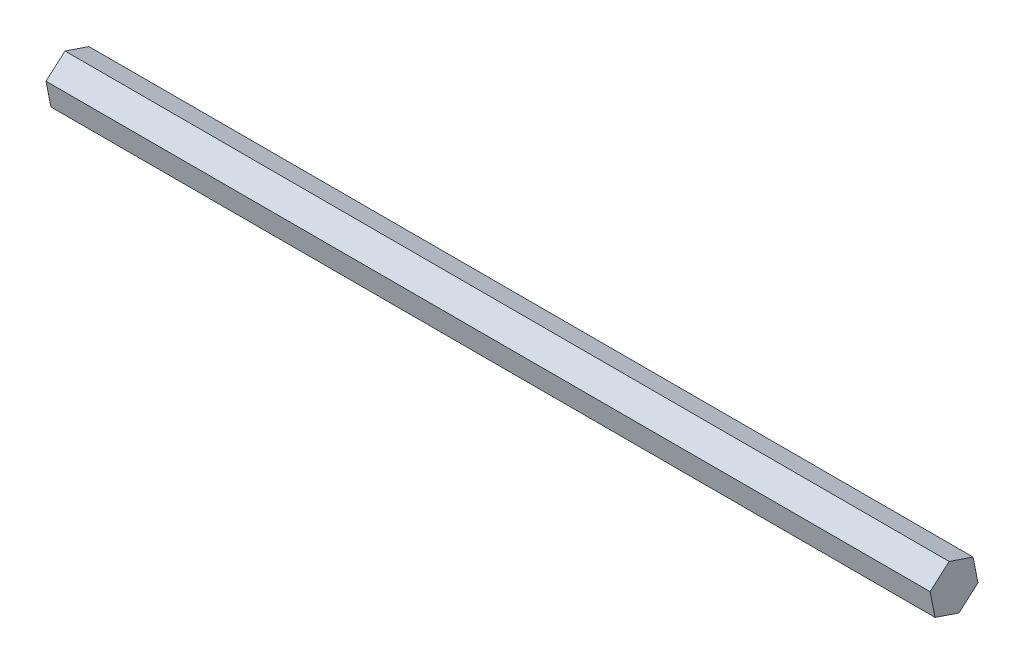
ISO-10303-21;
HEADER;
FILE_DESCRIPTION(('STEP AP214'),'2;1');
FILE_NAME('part.step','',(''),(''),'','','');
FILE_SCHEMA(('AUTOMOTIVE_DESIGN { 1 0 10303 214 1 1 1 1 }'));
ENDSEC;
DATA;
#1=APPLICATION_CONTEXT('core data for automotive mechanical design processes');
#2=APPLICATION_PROTOCOL_DEFINITION('international standard','automotive_design',2000,#1);
#3=PRODUCT_CONTEXT('',#1,'mechanical');
#4=PRODUCT('Part','Part','',(#3));
#5=PRODUCT_RELATED_PRODUCT_CATEGORY('part','',(#4));
#6=PRODUCT_DEFINITION_FORMATION('','',#4);
#7=PRODUCT_DEFINITION_CONTEXT('part definition',#1,'design');
#8=PRODUCT_DEFINITION('design','',#6,#7);
#9=PRODUCT_DEFINITION_SHAPE('','',#8);
#10=(LENGTH_UNIT() NAMED_UNIT(*) SI_UNIT(.MILLI.,.METRE.));
#11=(NAMED_UNIT(*) PLANE_ANGLE_UNIT() SI_UNIT($,.RADIAN.));
#12=(NAMED_UNIT(*) SI_UNIT($,.STERADIAN.) SOLID_ANGLE_UNIT());
#13=UNCERTAINTY_MEASURE_WITH_UNIT(LENGTH_MEASURE(1.E-05),#10,'distance_accuracy_value','');
#14=(GEOMETRIC_REPRESENTATION_CONTEXT(3) GLOBAL_UNCERTAINTY_ASSIGNED_CONTEXT((#13)) GLOBAL_UNIT_ASSIGNED_CONTEXT((#10,
#11,#12)) REPRESENTATION_CONTEXT('',''));
#15=CARTESIAN_POINT('',(0.,0.,0.));
#16=DIRECTION('',(0.,0.,1.));
#17=DIRECTION('',(1.,0.,0.));
#18=AXIS2_PLACEMENT_3D('',#15,#16,#17);
#19=CARTESIAN_POINT('',(256.54,-2.35794292459165,-6.94286961549052));
#20=DIRECTION('',(0.,-0.194943864196095,0.980814401307553));
#21=DIRECTION('',(0.,-0.980814401307553,-0.194943864196095));
#22=AXIS2_PLACEMENT_3D('',#19,#20,#21);
#23=PLANE('',#22);
#24=DIRECTION('',(0.,0.980814401307553,0.194943864196095));
#25=VECTOR('',#24,1.);
#26=CARTESIAN_POINT('',(0.,-2.35794292459165,-6.94286961549052));
#27=LINE('',#26,#25);
#28=CARTESIAN_POINT('',(0.,-2.35794292459165,-6.94286961549052));
#29=VERTEX_POINT('',#28);
#30=CARTESIAN_POINT('',(0.,4.83372999988206,-5.5134732811154));
#31=VERTEX_POINT('',#30);
#32=EDGE_CURVE('E117',#29,#31,#27,.T.);
#33=ORIENTED_EDGE('',*,*,#32,.T.);
#34=DIRECTION('',(-1.,0.,0.));
#35=VECTOR('',#34,1.);
#36=CARTESIAN_POINT('',(256.54,4.83372999988206,-5.5134732811154));
#37=LINE('',#36,#35);
#38=CARTESIAN_POINT('',(256.54,4.83372999988206,-5.5134732811154));
#39=VERTEX_POINT('',#38);
#40=EDGE_CURVE('E11',#39,#31,#37,.T.);
#41=ORIENTED_EDGE('',*,*,#40,.F.);
#42=DIRECTION('',(0.,0.980814401307553,0.194943864196095));
#43=VECTOR('',#42,1.);
#44=CARTESIAN_POINT('',(256.54,-2.35794292459165,-6.94286961549052));
#45=LINE('',#44,#43);
#46=CARTESIAN_POINT('',(256.54,-2.35794292459165,-6.94286961549052));
#47=VERTEX_POINT('',#46);
#48=EDGE_CURVE('E127',#47,#39,#45,.T.);
#49=ORIENTED_EDGE('',*,*,#48,.F.);
#50=DIRECTION('',(-1.,0.,0.));
#51=VECTOR('',#50,1.);
#52=CARTESIAN_POINT('',(256.54,-2.35794292459165,-6.94286961549052));
#53=LINE('',#52,#51);
#54=EDGE_CURVE('E113',#47,#29,#53,.T.);
#55=ORIENTED_EDGE('',*,*,#54,.T.);
#56=EDGE_LOOP('',(#33,#41,#49,#55));
#57=FACE_BOUND('',#56,.T.);
#58=ADVANCED_FACE('F33',(#57),#23,.F.);
#59=CARTESIAN_POINT('',(256.54,4.83372999988206,-5.5134732811154));
#60=DIRECTION('',(0.,-0.946882120028014,0.321580861948055));
#61=DIRECTION('',(0.,-0.321580861948055,-0.946882120028014));
#62=AXIS2_PLACEMENT_3D('',#59,#60,#61);
#63=PLANE('',#62);
#64=DIRECTION('',(0.,0.321580861948054,0.946882120028014));
#65=VECTOR('',#64,1.);
#66=CARTESIAN_POINT('',(0.,4.83372999988206,-5.5134732811154));
#67=LINE('',#66,#65);
#68=CARTESIAN_POINT('',(0.,7.19167292447371,1.42939633437511));
#69=VERTEX_POINT('',#68);
#70=EDGE_CURVE('E120',#31,#69,#67,.T.);
#71=ORIENTED_EDGE('',*,*,#70,.T.);
#72=DIRECTION('',(-1.,0.,0.));
#73=VECTOR('',#72,1.);
#74=CARTESIAN_POINT('',(256.54,7.19167292447371,1.42939633437511));
#75=LINE('',#74,#73);
#76=CARTESIAN_POINT('',(256.54,7.19167292447371,1.42939633437511));
#77=VERTEX_POINT('',#76);
#78=EDGE_CURVE('E41',#77,#69,#75,.T.);
#79=ORIENTED_EDGE('',*,*,#78,.F.);
#80=DIRECTION('',(0.,0.321580861948054,0.946882120028014));
#81=VECTOR('',#80,1.);
#82=CARTESIAN_POINT('',(256.54,4.83372999988206,-5.5134732811154));
#83=LINE('',#82,#81);
#84=EDGE_CURVE('E86',#39,#77,#83,.T.);
#85=ORIENTED_EDGE('',*,*,#84,.F.);
#86=ORIENTED_EDGE('',*,*,#40,.T.);
#87=EDGE_LOOP('',(#71,#79,#85,#86));
#88=FACE_BOUND('',#87,.T.);
#89=ADVANCED_FACE('F151',(#88),#63,.F.);
#90=CARTESIAN_POINT('',(256.54,7.19167292447371,1.42939633437511));
#91=DIRECTION('',(0.,-0.751938255831918,-0.659233539359499));
#92=DIRECTION('',(0.,0.659233539359499,-0.751938255831919));
#93=AXIS2_PLACEMENT_3D('',#90,#91,#92);
#94=PLANE('',#93);
#95=DIRECTION('',(0.,-0.659233539359499,0.751938255831918));
#96=VECTOR('',#95,1.);
#97=CARTESIAN_POINT('',(0.,7.19167292447371,1.42939633437511));
#98=LINE('',#97,#96);
#99=CARTESIAN_POINT('',(0.,2.35794292459165,6.94286961549052));
#100=VERTEX_POINT('',#99);
#101=EDGE_CURVE('E122',#69,#100,#98,.T.);
#102=ORIENTED_EDGE('',*,*,#101,.T.);
#103=DIRECTION('',(-1.,0.,0.));
#104=VECTOR('',#103,1.);
#105=CARTESIAN_POINT('',(256.54,2.35794292459165,6.94286961549052));
#106=LINE('',#105,#104);
#107=CARTESIAN_POINT('',(256.54,2.35794292459165,6.94286961549052));
#108=VERTEX_POINT('',#107);
#109=EDGE_CURVE('E108',#108,#100,#106,.T.);
#110=ORIENTED_EDGE('',*,*,#109,.F.);
#111=DIRECTION('',(0.,-0.659233539359499,0.751938255831918));
#112=VECTOR('',#111,1.);
#113=CARTESIAN_POINT('',(256.54,7.19167292447371,1.42939633437511));
#114=LINE('',#113,#112);
#115=EDGE_CURVE('E99',#77,#108,#114,.T.);
#116=ORIENTED_EDGE('',*,*,#115,.F.);
#117=ORIENTED_EDGE('',*,*,#78,.T.);
#118=EDGE_LOOP('',(#102,#110,#116,#117));
#119=FACE_BOUND('',#118,.T.);
#120=ADVANCED_FACE('F133',(#119),#94,.F.);
#121=CARTESIAN_POINT('',(256.54,2.35794292459165,6.94286961549052));
#122=DIRECTION('',(0.,0.194943864196096,-0.980814401307553));
#123=DIRECTION('',(0.,0.980814401307553,0.194943864196096));
#124=AXIS2_PLACEMENT_3D('',#121,#122,#123);
#125=PLANE('',#124);
#126=DIRECTION('',(0.,-0.980814401307553,-0.194943864196096));
#127=VECTOR('',#126,1.);
#128=CARTESIAN_POINT('',(0.,2.35794292459165,6.94286961549052));
#129=LINE('',#128,#127);
#130=CARTESIAN_POINT('',(0.,-4.83372999988206,5.5134732811154));
#131=VERTEX_POINT('',#130);
#132=EDGE_CURVE('E107',#100,#131,#129,.T.);
#133=ORIENTED_EDGE('',*,*,#132,.T.);
#134=DIRECTION('',(-1.,0.,0.));
#135=VECTOR('',#134,1.);
#136=CARTESIAN_POINT('',(256.54,-4.83372999988206,5.5134732811154));
#137=LINE('',#136,#135);
#138=CARTESIAN_POINT('',(256.54,-4.83372999988206,5.5134732811154));
#139=VERTEX_POINT('',#138);
#140=EDGE_CURVE('E104',#139,#131,#137,.T.);
#141=ORIENTED_EDGE('',*,*,#140,.F.);
#142=DIRECTION('',(0.,-0.980814401307553,-0.194943864196096));
#143=VECTOR('',#142,1.);
#144=CARTESIAN_POINT('',(256.54,2.35794292459165,6.94286961549052));
#145=LINE('',#144,#143);
#146=EDGE_CURVE('E93',#108,#139,#145,.T.);
#147=ORIENTED_EDGE('',*,*,#146,.F.);
#148=ORIENTED_EDGE('',*,*,#109,.T.);
#149=EDGE_LOOP('',(#133,#141,#147,#148));
#150=FACE_BOUND('',#149,.T.);
#151=ADVANCED_FACE('F105',(#150),#125,.F.);
#152=CARTESIAN_POINT('',(256.54,-4.83372999988206,5.5134732811154));
#153=DIRECTION('',(0.,0.946882120028014,-0.321580861948055));
#154=DIRECTION('',(0.,0.321580861948055,0.946882120028014));
#155=AXIS2_PLACEMENT_3D('',#152,#153,#154);
#156=PLANE('',#155);
#157=DIRECTION('',(0.,-0.321580861948054,-0.946882120028014));
#158=VECTOR('',#157,1.);
#159=CARTESIAN_POINT('',(0.,-4.83372999988206,5.5134732811154));
#160=LINE('',#159,#158);
#161=CARTESIAN_POINT('',(0.,-7.19167292447371,-1.42939633437511));
#162=VERTEX_POINT('',#161);
#163=EDGE_CURVE('E72',#131,#162,#160,.T.);
#164=ORIENTED_EDGE('',*,*,#163,.T.);
#165=DIRECTION('',(-1.,0.,0.));
#166=VECTOR('',#165,1.);
#167=CARTESIAN_POINT('',(256.54,-7.19167292447371,-1.42939633437511));
#168=LINE('',#167,#166);
#169=CARTESIAN_POINT('',(256.54,-7.19167292447371,-1.42939633437511));
#170=VERTEX_POINT('',#169);
#171=EDGE_CURVE('E109',#170,#162,#168,.T.);
#172=ORIENTED_EDGE('',*,*,#171,.F.);
#173=DIRECTION('',(0.,-0.321580861948054,-0.946882120028014));
#174=VECTOR('',#173,1.);
#175=CARTESIAN_POINT('',(256.54,-4.83372999988206,5.5134732811154));
#176=LINE('',#175,#174);
#177=EDGE_CURVE('E97',#139,#170,#176,.T.);
#178=ORIENTED_EDGE('',*,*,#177,.F.);
#179=ORIENTED_EDGE('',*,*,#140,.T.);
#180=EDGE_LOOP('',(#164,#172,#178,#179));
#181=FACE_BOUND('',#180,.T.);
#182=ADVANCED_FACE('F111',(#181),#156,.F.);
#183=CARTESIAN_POINT('',(256.54,-7.19167292447371,-1.42939633437511));
#184=DIRECTION('',(0.,0.751938255831919,0.659233539359499));
#185=DIRECTION('',(0.,-0.659233539359499,0.751938255831919));
#186=AXIS2_PLACEMENT_3D('',#183,#184,#185);
#187=PLANE('',#186);
#188=DIRECTION('',(0.,0.659233539359499,-0.751938255831919));
#189=VECTOR('',#188,1.);
#190=CARTESIAN_POINT('',(0.,-7.19167292447371,-1.42939633437511));
#191=LINE('',#190,#189);
#192=EDGE_CURVE('E78',#162,#29,#191,.T.);
#193=ORIENTED_EDGE('',*,*,#192,.T.);
#194=ORIENTED_EDGE('',*,*,#54,.F.);
#195=DIRECTION('',(0.,0.659233539359499,-0.751938255831919));
#196=VECTOR('',#195,1.);
#197=CARTESIAN_POINT('',(256.54,-7.19167292447371,-1.42939633437511));
#198=LINE('',#197,#196);
#199=EDGE_CURVE('E49',#170,#47,#198,.T.);
#200=ORIENTED_EDGE('',*,*,#199,.F.);
#201=ORIENTED_EDGE('',*,*,#171,.T.);
#202=EDGE_LOOP('',(#193,#194,#200,#201));
#203=FACE_BOUND('',#202,.T.);
#204=ADVANCED_FACE('F140',(#203),#187,.F.);
#205=CARTESIAN_POINT('',(256.54,0.,0.));
#206=DIRECTION('',(1.,0.,0.));
#207=DIRECTION('',(0.,0.,-1.));
#208=AXIS2_PLACEMENT_3D('',#205,#206,#207);
#209=PLANE('',#208);
#210=ORIENTED_EDGE('',*,*,#48,.T.);
#211=ORIENTED_EDGE('',*,*,#84,.T.);
#212=ORIENTED_EDGE('',*,*,#115,.T.);
#213=ORIENTED_EDGE('',*,*,#146,.T.);
#214=ORIENTED_EDGE('',*,*,#177,.T.);
#215=ORIENTED_EDGE('',*,*,#199,.T.);
#216=EDGE_LOOP('',(#210,#211,#212,#213,#214,#215));
#217=FACE_BOUND('',#216,.T.);
#218=ADVANCED_FACE('F95',(#217),#209,.T.);
#219=CARTESIAN_POINT('',(0.,0.,0.));
#220=DIRECTION('',(1.,0.,0.));
#221=DIRECTION('',(0.,0.,-1.));
#222=AXIS2_PLACEMENT_3D('',#219,#220,#221);
#223=PLANE('',#222);
#224=ORIENTED_EDGE('',*,*,#32,.F.);
#225=ORIENTED_EDGE('',*,*,#192,.F.);
#226=ORIENTED_EDGE('',*,*,#163,.F.);
#227=ORIENTED_EDGE('',*,*,#132,.F.);
#228=ORIENTED_EDGE('',*,*,#101,.F.);
#229=ORIENTED_EDGE('',*,*,#70,.F.);
#230=EDGE_LOOP('',(#224,#225,#226,#227,#228,#229));
#231=FACE_BOUND('',#230,.T.);
#232=ADVANCED_FACE('F136',(#231),#223,.F.);
#233=CLOSED_SHELL('',(#58,#89,#120,#151,#182,#204,#218,#232));
#234=MANIFOLD_SOLID_BREP('B2',#233);
#235=ADVANCED_BREP_SHAPE_REPRESENTATION('',(#18,#234),#14);
#236=SHAPE_DEFINITION_REPRESENTATION(#9,#235);
ENDSEC;
END-ISO-10303-21;
